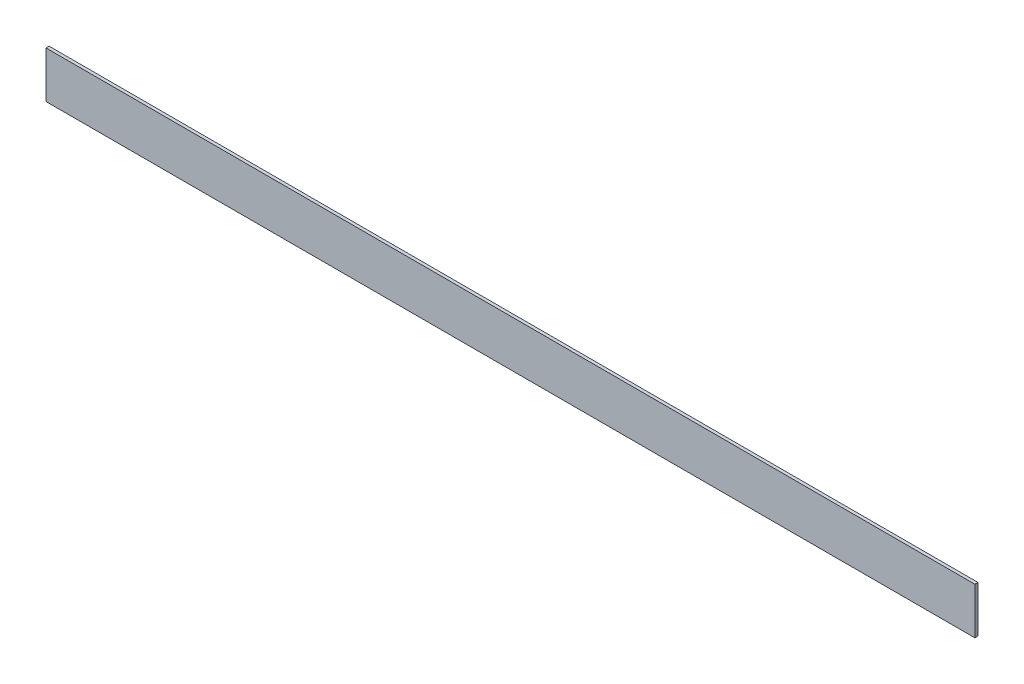
ISO-10303-21;
HEADER;
FILE_DESCRIPTION(('STEP AP214'),'2;1');
FILE_NAME('part.step','',(''),(''),'','','');
FILE_SCHEMA(('AUTOMOTIVE_DESIGN { 1 0 10303 214 1 1 1 1 }'));
ENDSEC;
DATA;
#1=APPLICATION_CONTEXT('core data for automotive mechanical design processes');
#2=APPLICATION_PROTOCOL_DEFINITION('international standard','automotive_design',2000,#1);
#3=PRODUCT_CONTEXT('',#1,'mechanical');
#4=PRODUCT('Part','Part','',(#3));
#5=PRODUCT_RELATED_PRODUCT_CATEGORY('part','',(#4));
#6=PRODUCT_DEFINITION_FORMATION('','',#4);
#7=PRODUCT_DEFINITION_CONTEXT('part definition',#1,'design');
#8=PRODUCT_DEFINITION('design','',#6,#7);
#9=PRODUCT_DEFINITION_SHAPE('','',#8);
#10=(LENGTH_UNIT() NAMED_UNIT(*) SI_UNIT(.MILLI.,.METRE.));
#11=(NAMED_UNIT(*) PLANE_ANGLE_UNIT() SI_UNIT($,.RADIAN.));
#12=(NAMED_UNIT(*) SI_UNIT($,.STERADIAN.) SOLID_ANGLE_UNIT());
#13=UNCERTAINTY_MEASURE_WITH_UNIT(LENGTH_MEASURE(1.E-05),#10,'distance_accuracy_value','');
#14=(GEOMETRIC_REPRESENTATION_CONTEXT(3) GLOBAL_UNCERTAINTY_ASSIGNED_CONTEXT((#13)) GLOBAL_UNIT_ASSIGNED_CONTEXT((#10,
#11,#12)) REPRESENTATION_CONTEXT('',''));
#15=CARTESIAN_POINT('',(0.,0.,0.));
#16=DIRECTION('',(0.,0.,1.));
#17=DIRECTION('',(1.,0.,0.));
#18=AXIS2_PLACEMENT_3D('',#15,#16,#17);
#19=CARTESIAN_POINT('',(0.,0.,2.));
#20=DIRECTION('',(1.,0.,0.));
#21=DIRECTION('',(0.,0.,-1.));
#22=AXIS2_PLACEMENT_3D('',#19,#20,#21);
#23=PLANE('',#22);
#24=DIRECTION('',(0.,-1.,0.));
#25=VECTOR('',#24,1.);
#26=CARTESIAN_POINT('',(0.,0.,0.));
#27=LINE('',#26,#25);
#28=CARTESIAN_POINT('',(0.,30.,0.));
#29=VERTEX_POINT('',#28);
#30=CARTESIAN_POINT('',(0.,0.,0.));
#31=VERTEX_POINT('',#30);
#32=EDGE_CURVE('E96',#29,#31,#27,.T.);
#33=ORIENTED_EDGE('',*,*,#32,.T.);
#34=DIRECTION('',(0.,0.,-1.));
#35=VECTOR('',#34,1.);
#36=CARTESIAN_POINT('',(0.,0.,2.));
#37=LINE('',#36,#35);
#38=CARTESIAN_POINT('',(0.,0.,2.));
#39=VERTEX_POINT('',#38);
#40=EDGE_CURVE('E11',#39,#31,#37,.T.);
#41=ORIENTED_EDGE('',*,*,#40,.F.);
#42=DIRECTION('',(0.,-1.,0.));
#43=VECTOR('',#42,1.);
#44=CARTESIAN_POINT('',(0.,0.,2.));
#45=LINE('',#44,#43);
#46=CARTESIAN_POINT('',(0.,30.,2.));
#47=VERTEX_POINT('',#46);
#48=EDGE_CURVE('E84',#47,#39,#45,.T.);
#49=ORIENTED_EDGE('',*,*,#48,.F.);
#50=DIRECTION('',(0.,0.,-1.));
#51=VECTOR('',#50,1.);
#52=CARTESIAN_POINT('',(0.,30.,2.));
#53=LINE('',#52,#51);
#54=EDGE_CURVE('E92',#47,#29,#53,.T.);
#55=ORIENTED_EDGE('',*,*,#54,.T.);
#56=EDGE_LOOP('',(#33,#41,#49,#55));
#57=FACE_BOUND('',#56,.T.);
#58=ADVANCED_FACE('F33',(#57),#23,.F.);
#59=CARTESIAN_POINT('',(0.,0.,2.));
#60=DIRECTION('',(0.,1.,0.));
#61=DIRECTION('',(0.,0.,1.));
#62=AXIS2_PLACEMENT_3D('',#59,#60,#61);
#63=PLANE('',#62);
#64=DIRECTION('',(1.,0.,0.));
#65=VECTOR('',#64,1.);
#66=CARTESIAN_POINT('',(0.,0.,0.));
#67=LINE('',#66,#65);
#68=CARTESIAN_POINT('',(600.,0.,0.));
#69=VERTEX_POINT('',#68);
#70=EDGE_CURVE('E88',#31,#69,#67,.T.);
#71=ORIENTED_EDGE('',*,*,#70,.T.);
#72=DIRECTION('',(0.,0.,-1.));
#73=VECTOR('',#72,1.);
#74=CARTESIAN_POINT('',(600.,0.,2.));
#75=LINE('',#74,#73);
#76=CARTESIAN_POINT('',(600.,0.,2.));
#77=VERTEX_POINT('',#76);
#78=EDGE_CURVE('E41',#77,#69,#75,.T.);
#79=ORIENTED_EDGE('',*,*,#78,.F.);
#80=DIRECTION('',(1.,0.,0.));
#81=VECTOR('',#80,1.);
#82=CARTESIAN_POINT('',(0.,0.,2.));
#83=LINE('',#82,#81);
#84=EDGE_CURVE('E79',#39,#77,#83,.T.);
#85=ORIENTED_EDGE('',*,*,#84,.F.);
#86=ORIENTED_EDGE('',*,*,#40,.T.);
#87=EDGE_LOOP('',(#71,#79,#85,#86));
#88=FACE_BOUND('',#87,.T.);
#89=ADVANCED_FACE('F87',(#88),#63,.F.);
#90=CARTESIAN_POINT('',(600.,0.,2.));
#91=DIRECTION('',(-1.,0.,0.));
#92=DIRECTION('',(0.,0.,1.));
#93=AXIS2_PLACEMENT_3D('',#90,#91,#92);
#94=PLANE('',#93);
#95=DIRECTION('',(0.,1.,0.));
#96=VECTOR('',#95,1.);
#97=CARTESIAN_POINT('',(600.,0.,0.));
#98=LINE('',#97,#96);
#99=CARTESIAN_POINT('',(600.,30.,0.));
#100=VERTEX_POINT('',#99);
#101=EDGE_CURVE('E66',#69,#100,#98,.T.);
#102=ORIENTED_EDGE('',*,*,#101,.T.);
#103=DIRECTION('',(0.,0.,-1.));
#104=VECTOR('',#103,1.);
#105=CARTESIAN_POINT('',(600.,30.,2.));
#106=LINE('',#105,#104);
#107=CARTESIAN_POINT('',(600.,30.,2.));
#108=VERTEX_POINT('',#107);
#109=EDGE_CURVE('E89',#108,#100,#106,.T.);
#110=ORIENTED_EDGE('',*,*,#109,.F.);
#111=DIRECTION('',(0.,1.,0.));
#112=VECTOR('',#111,1.);
#113=CARTESIAN_POINT('',(600.,0.,2.));
#114=LINE('',#113,#112);
#115=EDGE_CURVE('E82',#77,#108,#114,.T.);
#116=ORIENTED_EDGE('',*,*,#115,.F.);
#117=ORIENTED_EDGE('',*,*,#78,.T.);
#118=EDGE_LOOP('',(#102,#110,#116,#117));
#119=FACE_BOUND('',#118,.T.);
#120=ADVANCED_FACE('F90',(#119),#94,.F.);
#121=CARTESIAN_POINT('',(0.,30.,2.));
#122=DIRECTION('',(0.,-1.,0.));
#123=DIRECTION('',(0.,0.,-1.));
#124=AXIS2_PLACEMENT_3D('',#121,#122,#123);
#125=PLANE('',#124);
#126=DIRECTION('',(-1.,0.,0.));
#127=VECTOR('',#126,1.);
#128=CARTESIAN_POINT('',(0.,30.,0.));
#129=LINE('',#128,#127);
#130=EDGE_CURVE('E72',#100,#29,#129,.T.);
#131=ORIENTED_EDGE('',*,*,#130,.T.);
#132=ORIENTED_EDGE('',*,*,#54,.F.);
#133=DIRECTION('',(-1.,0.,0.));
#134=VECTOR('',#133,1.);
#135=CARTESIAN_POINT('',(0.,30.,2.));
#136=LINE('',#135,#134);
#137=EDGE_CURVE('E49',#108,#47,#136,.T.);
#138=ORIENTED_EDGE('',*,*,#137,.F.);
#139=ORIENTED_EDGE('',*,*,#109,.T.);
#140=EDGE_LOOP('',(#131,#132,#138,#139));
#141=FACE_BOUND('',#140,.T.);
#142=ADVANCED_FACE('F103',(#141),#125,.F.);
#143=CARTESIAN_POINT('',(0.,0.,2.));
#144=DIRECTION('',(0.,0.,-1.));
#145=DIRECTION('',(-1.,0.,0.));
#146=AXIS2_PLACEMENT_3D('',#143,#144,#145);
#147=PLANE('',#146);
#148=ORIENTED_EDGE('',*,*,#48,.T.);
#149=ORIENTED_EDGE('',*,*,#84,.T.);
#150=ORIENTED_EDGE('',*,*,#115,.T.);
#151=ORIENTED_EDGE('',*,*,#137,.T.);
#152=EDGE_LOOP('',(#148,#149,#150,#151));
#153=FACE_BOUND('',#152,.T.);
#154=ADVANCED_FACE('F80',(#153),#147,.F.);
#155=CARTESIAN_POINT('',(0.,0.,0.));
#156=DIRECTION('',(0.,0.,-1.));
#157=DIRECTION('',(-1.,0.,0.));
#158=AXIS2_PLACEMENT_3D('',#155,#156,#157);
#159=PLANE('',#158);
#160=ORIENTED_EDGE('',*,*,#32,.F.);
#161=ORIENTED_EDGE('',*,*,#130,.F.);
#162=ORIENTED_EDGE('',*,*,#101,.F.);
#163=ORIENTED_EDGE('',*,*,#70,.F.);
#164=EDGE_LOOP('',(#160,#161,#162,#163));
#165=FACE_BOUND('',#164,.T.);
#166=ADVANCED_FACE('F106',(#165),#159,.T.);
#167=CLOSED_SHELL('',(#58,#89,#120,#142,#154,#166));
#168=MANIFOLD_SOLID_BREP('B2',#167);
#169=ADVANCED_BREP_SHAPE_REPRESENTATION('',(#18,#168),#14);
#170=SHAPE_DEFINITION_REPRESENTATION(#9,#169);
ENDSEC;
END-ISO-10303-21;
